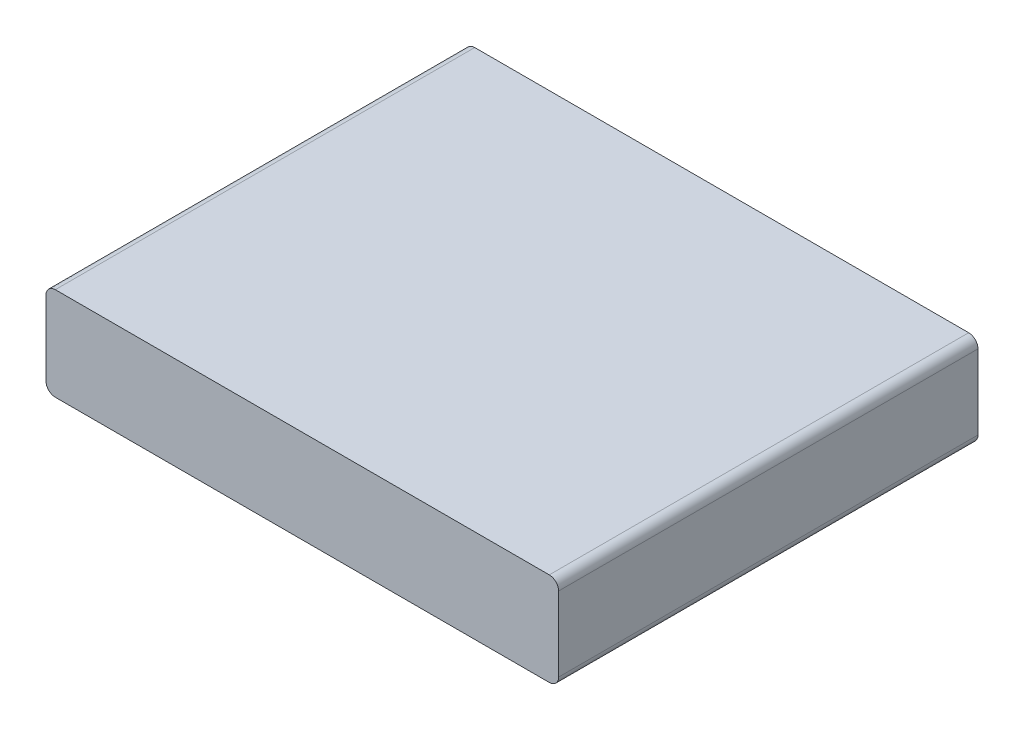
ISO-10303-21;
HEADER;
FILE_DESCRIPTION(('STEP AP214'),'2;1');
FILE_NAME('part.step','',(''),(''),'','','');
FILE_SCHEMA(('AUTOMOTIVE_DESIGN { 1 0 10303 214 1 1 1 1 }'));
ENDSEC;
DATA;
#1=APPLICATION_CONTEXT('core data for automotive mechanical design processes');
#2=APPLICATION_PROTOCOL_DEFINITION('international standard','automotive_design',2000,#1);
#3=PRODUCT_CONTEXT('',#1,'mechanical');
#4=PRODUCT('Part','Part','',(#3));
#5=PRODUCT_RELATED_PRODUCT_CATEGORY('part','',(#4));
#6=PRODUCT_DEFINITION_FORMATION('','',#4);
#7=PRODUCT_DEFINITION_CONTEXT('part definition',#1,'design');
#8=PRODUCT_DEFINITION('design','',#6,#7);
#9=PRODUCT_DEFINITION_SHAPE('','',#8);
#10=(LENGTH_UNIT() NAMED_UNIT(*) SI_UNIT(.MILLI.,.METRE.));
#11=(NAMED_UNIT(*) PLANE_ANGLE_UNIT() SI_UNIT($,.RADIAN.));
#12=(NAMED_UNIT(*) SI_UNIT($,.STERADIAN.) SOLID_ANGLE_UNIT());
#13=UNCERTAINTY_MEASURE_WITH_UNIT(LENGTH_MEASURE(1.E-05),#10,'distance_accuracy_value','');
#14=(GEOMETRIC_REPRESENTATION_CONTEXT(3) GLOBAL_UNCERTAINTY_ASSIGNED_CONTEXT((#13)) GLOBAL_UNIT_ASSIGNED_CONTEXT((#10,
#11,#12)) REPRESENTATION_CONTEXT('',''));
#15=CARTESIAN_POINT('',(0.,0.,0.));
#16=DIRECTION('',(0.,0.,1.));
#17=DIRECTION('',(1.,0.,0.));
#18=AXIS2_PLACEMENT_3D('',#15,#16,#17);
#19=CARTESIAN_POINT('',(-163.912429378531,100.,-242.973163841808));
#20=DIRECTION('',(1.,0.,0.));
#21=DIRECTION('',(0.,0.,-1.));
#22=AXIS2_PLACEMENT_3D('',#19,#20,#21);
#23=PLANE('',#22);
#24=DIRECTION('',(0.,-1.,0.));
#25=VECTOR('',#24,1.);
#26=CARTESIAN_POINT('',(-163.912429378531,100.,-242.973163841808));
#27=LINE('',#26,#25);
#28=CARTESIAN_POINT('',(-163.912429378531,90.,-242.973163841808));
#29=VERTEX_POINT('',#28);
#30=CARTESIAN_POINT('',(-163.912429378531,9.99999999999999,-242.973163841808));
#31=VERTEX_POINT('',#30);
#32=EDGE_CURVE('E121',#29,#31,#27,.T.);
#33=ORIENTED_EDGE('',*,*,#32,.T.);
#34=DIRECTION('',(0.,0.,1.));
#35=VECTOR('',#34,1.);
#36=CARTESIAN_POINT('',(-163.912429378531,9.99999999999999,-242.973163841808));
#37=LINE('',#36,#35);
#38=CARTESIAN_POINT('',(-163.912429378531,9.99999999999999,207.026836158192));
#39=VERTEX_POINT('',#38);
#40=EDGE_CURVE('E11',#31,#39,#37,.T.);
#41=ORIENTED_EDGE('',*,*,#40,.T.);
#42=DIRECTION('',(0.,-1.,0.));
#43=VECTOR('',#42,1.);
#44=CARTESIAN_POINT('',(-163.912429378531,100.,207.026836158192));
#45=LINE('',#44,#43);
#46=CARTESIAN_POINT('',(-163.912429378531,90.,207.026836158192));
#47=VERTEX_POINT('',#46);
#48=EDGE_CURVE('E126',#47,#39,#45,.T.);
#49=ORIENTED_EDGE('',*,*,#48,.F.);
#50=DIRECTION('',(0.,0.,1.));
#51=VECTOR('',#50,1.);
#52=CARTESIAN_POINT('',(-163.912429378531,90.,-242.973163841808));
#53=LINE('',#52,#51);
#54=EDGE_CURVE('E41',#47,#29,#53,.F.);
#55=ORIENTED_EDGE('',*,*,#54,.T.);
#56=EDGE_LOOP('',(#33,#41,#49,#55));
#57=FACE_BOUND('',#56,.T.);
#58=ADVANCED_FACE('F33',(#57),#23,.F.);
#59=CARTESIAN_POINT('',(-163.912429378531,100.,207.026836158192));
#60=DIRECTION('',(0.,0.,-1.));
#61=DIRECTION('',(-1.,0.,0.));
#62=AXIS2_PLACEMENT_3D('',#59,#60,#61);
#63=PLANE('',#62);
#64=DIRECTION('',(1.,0.,0.));
#65=VECTOR('',#64,1.);
#66=CARTESIAN_POINT('',(-163.912429378531,0.,207.026836158192));
#67=LINE('',#66,#65);
#68=CARTESIAN_POINT('',(-153.912429378531,0.,207.026836158192));
#69=VERTEX_POINT('',#68);
#70=CARTESIAN_POINT('',(376.087570621469,0.,207.026836158192));
#71=VERTEX_POINT('',#70);
#72=EDGE_CURVE('E168',#69,#71,#67,.T.);
#73=ORIENTED_EDGE('',*,*,#72,.T.);
#74=CARTESIAN_POINT('',(376.087570621469,9.99999999999999,207.026836158192));
#75=DIRECTION('',(0.,0.,-1.));
#76=DIRECTION('',(-1.,0.,0.));
#77=AXIS2_PLACEMENT_3D('',#74,#75,#76);
#78=CIRCLE('',#77,10.);
#79=CARTESIAN_POINT('',(386.087570621469,9.99999999999999,207.026836158192));
#80=VERTEX_POINT('',#79);
#81=EDGE_CURVE('E143',#71,#80,#78,.F.);
#82=ORIENTED_EDGE('',*,*,#81,.T.);
#83=DIRECTION('',(0.,-1.,0.));
#84=VECTOR('',#83,1.);
#85=CARTESIAN_POINT('',(386.087570621469,100.,207.026836158192));
#86=LINE('',#85,#84);
#87=CARTESIAN_POINT('',(386.087570621469,90.,207.026836158192));
#88=VERTEX_POINT('',#87);
#89=EDGE_CURVE('E120',#88,#80,#86,.T.);
#90=ORIENTED_EDGE('',*,*,#89,.F.);
#91=CARTESIAN_POINT('',(376.087570621469,90.,207.026836158192));
#92=DIRECTION('',(0.,0.,-1.));
#93=DIRECTION('',(-1.,0.,0.));
#94=AXIS2_PLACEMENT_3D('',#91,#92,#93);
#95=CIRCLE('',#94,10.);
#96=CARTESIAN_POINT('',(376.087570621469,100.,207.026836158192));
#97=VERTEX_POINT('',#96);
#98=EDGE_CURVE('E125',#88,#97,#95,.F.);
#99=ORIENTED_EDGE('',*,*,#98,.T.);
#100=DIRECTION('',(1.,0.,0.));
#101=VECTOR('',#100,1.);
#102=CARTESIAN_POINT('',(-163.912429378531,100.,207.026836158192));
#103=LINE('',#102,#101);
#104=CARTESIAN_POINT('',(-153.912429378531,100.,207.026836158192));
#105=VERTEX_POINT('',#104);
#106=EDGE_CURVE('E162',#105,#97,#103,.T.);
#107=ORIENTED_EDGE('',*,*,#106,.F.);
#108=CARTESIAN_POINT('',(-153.912429378531,90.,207.026836158192));
#109=DIRECTION('',(0.,0.,-1.));
#110=DIRECTION('',(-1.,0.,0.));
#111=AXIS2_PLACEMENT_3D('',#108,#109,#110);
#112=CIRCLE('',#111,10.);
#113=EDGE_CURVE('E55',#105,#47,#112,.F.);
#114=ORIENTED_EDGE('',*,*,#113,.T.);
#115=ORIENTED_EDGE('',*,*,#48,.T.);
#116=CARTESIAN_POINT('',(-153.912429378531,9.99999999999999,207.026836158192));
#117=DIRECTION('',(0.,0.,-1.));
#118=DIRECTION('',(-1.,0.,0.));
#119=AXIS2_PLACEMENT_3D('',#116,#117,#118);
#120=CIRCLE('',#119,10.);
#121=EDGE_CURVE('E48',#39,#69,#120,.F.);
#122=ORIENTED_EDGE('',*,*,#121,.T.);
#123=EDGE_LOOP('',(#73,#82,#90,#99,#107,#114,#115,#122));
#124=FACE_BOUND('',#123,.T.);
#125=ADVANCED_FACE('F164',(#124),#63,.F.);
#126=CARTESIAN_POINT('',(386.087570621469,100.,-242.973163841808));
#127=DIRECTION('',(-1.,0.,0.));
#128=DIRECTION('',(0.,0.,1.));
#129=AXIS2_PLACEMENT_3D('',#126,#127,#128);
#130=PLANE('',#129);
#131=ORIENTED_EDGE('',*,*,#89,.T.);
#132=DIRECTION('',(0.,0.,-1.));
#133=VECTOR('',#132,1.);
#134=CARTESIAN_POINT('',(386.087570621469,9.99999999999999,-242.973163841808));
#135=LINE('',#134,#133);
#136=CARTESIAN_POINT('',(386.087570621469,9.99999999999999,-242.973163841808));
#137=VERTEX_POINT('',#136);
#138=EDGE_CURVE('E119',#80,#137,#135,.T.);
#139=ORIENTED_EDGE('',*,*,#138,.T.);
#140=DIRECTION('',(0.,-1.,0.));
#141=VECTOR('',#140,1.);
#142=CARTESIAN_POINT('',(386.087570621469,100.,-242.973163841808));
#143=LINE('',#142,#141);
#144=CARTESIAN_POINT('',(386.087570621469,90.,-242.973163841808));
#145=VERTEX_POINT('',#144);
#146=EDGE_CURVE('E102',#145,#137,#143,.T.);
#147=ORIENTED_EDGE('',*,*,#146,.F.);
#148=DIRECTION('',(0.,0.,-1.));
#149=VECTOR('',#148,1.);
#150=CARTESIAN_POINT('',(386.087570621469,90.,207.026836158192));
#151=LINE('',#150,#149);
#152=EDGE_CURVE('E116',#145,#88,#151,.F.);
#153=ORIENTED_EDGE('',*,*,#152,.T.);
#154=EDGE_LOOP('',(#131,#139,#147,#153));
#155=FACE_BOUND('',#154,.T.);
#156=ADVANCED_FACE('F115',(#155),#130,.F.);
#157=CARTESIAN_POINT('',(-163.912429378531,100.,-242.973163841808));
#158=DIRECTION('',(0.,0.,1.));
#159=DIRECTION('',(1.,0.,0.));
#160=AXIS2_PLACEMENT_3D('',#157,#158,#159);
#161=PLANE('',#160);
#162=ORIENTED_EDGE('',*,*,#146,.T.);
#163=CARTESIAN_POINT('',(376.087570621469,9.99999999999999,-242.973163841808));
#164=DIRECTION('',(0.,0.,1.));
#165=DIRECTION('',(1.,0.,0.));
#166=AXIS2_PLACEMENT_3D('',#163,#164,#165);
#167=CIRCLE('',#166,10.);
#168=CARTESIAN_POINT('',(376.087570621469,0.,-242.973163841808));
#169=VERTEX_POINT('',#168);
#170=EDGE_CURVE('E109',#137,#169,#167,.F.);
#171=ORIENTED_EDGE('',*,*,#170,.T.);
#172=DIRECTION('',(-1.,0.,0.));
#173=VECTOR('',#172,1.);
#174=CARTESIAN_POINT('',(-163.912429378531,0.,-242.973163841808));
#175=LINE('',#174,#173);
#176=CARTESIAN_POINT('',(-153.912429378531,0.,-242.973163841808));
#177=VERTEX_POINT('',#176);
#178=EDGE_CURVE('E165',#169,#177,#175,.T.);
#179=ORIENTED_EDGE('',*,*,#178,.T.);
#180=CARTESIAN_POINT('',(-153.912429378531,9.99999999999999,-242.973163841808));
#181=DIRECTION('',(0.,0.,1.));
#182=DIRECTION('',(1.,0.,0.));
#183=AXIS2_PLACEMENT_3D('',#180,#181,#182);
#184=CIRCLE('',#183,10.);
#185=EDGE_CURVE('E110',#177,#31,#184,.F.);
#186=ORIENTED_EDGE('',*,*,#185,.T.);
#187=ORIENTED_EDGE('',*,*,#32,.F.);
#188=CARTESIAN_POINT('',(-153.912429378531,90.,-242.973163841808));
#189=DIRECTION('',(0.,0.,1.));
#190=DIRECTION('',(1.,0.,0.));
#191=AXIS2_PLACEMENT_3D('',#188,#189,#190);
#192=CIRCLE('',#191,10.);
#193=CARTESIAN_POINT('',(-153.912429378531,100.,-242.973163841808));
#194=VERTEX_POINT('',#193);
#195=EDGE_CURVE('E128',#29,#194,#192,.F.);
#196=ORIENTED_EDGE('',*,*,#195,.T.);
#197=DIRECTION('',(-1.,0.,0.));
#198=VECTOR('',#197,1.);
#199=CARTESIAN_POINT('',(-163.912429378531,100.,-242.973163841808));
#200=LINE('',#199,#198);
#201=CARTESIAN_POINT('',(376.087570621469,100.,-242.973163841808));
#202=VERTEX_POINT('',#201);
#203=EDGE_CURVE('E104',#202,#194,#200,.T.);
#204=ORIENTED_EDGE('',*,*,#203,.F.);
#205=CARTESIAN_POINT('',(376.087570621469,90.,-242.973163841808));
#206=DIRECTION('',(0.,0.,1.));
#207=DIRECTION('',(1.,0.,0.));
#208=AXIS2_PLACEMENT_3D('',#205,#206,#207);
#209=CIRCLE('',#208,10.);
#210=EDGE_CURVE('E99',#202,#145,#209,.F.);
#211=ORIENTED_EDGE('',*,*,#210,.T.);
#212=EDGE_LOOP('',(#162,#171,#179,#186,#187,#196,#204,#211));
#213=FACE_BOUND('',#212,.T.);
#214=ADVANCED_FACE('F101',(#213),#161,.F.);
#215=CARTESIAN_POINT('',(0.,100.,0.));
#216=DIRECTION('',(0.,1.,0.));
#217=DIRECTION('',(0.,0.,1.));
#218=AXIS2_PLACEMENT_3D('',#215,#216,#217);
#219=PLANE('',#218);
#220=ORIENTED_EDGE('',*,*,#106,.T.);
#221=DIRECTION('',(0.,0.,-1.));
#222=VECTOR('',#221,1.);
#223=CARTESIAN_POINT('',(376.087570621469,100.,-242.973163841808));
#224=LINE('',#223,#222);
#225=EDGE_CURVE('E148',#97,#202,#224,.T.);
#226=ORIENTED_EDGE('',*,*,#225,.T.);
#227=ORIENTED_EDGE('',*,*,#203,.T.);
#228=DIRECTION('',(0.,0.,1.));
#229=VECTOR('',#228,1.);
#230=CARTESIAN_POINT('',(-153.912429378531,100.,207.026836158192));
#231=LINE('',#230,#229);
#232=EDGE_CURVE('E145',#194,#105,#231,.T.);
#233=ORIENTED_EDGE('',*,*,#232,.T.);
#234=EDGE_LOOP('',(#220,#226,#227,#233));
#235=FACE_BOUND('',#234,.T.);
#236=ADVANCED_FACE('F161',(#235),#219,.T.);
#237=CARTESIAN_POINT('',(0.,0.,0.));
#238=DIRECTION('',(0.,1.,0.));
#239=DIRECTION('',(0.,0.,1.));
#240=AXIS2_PLACEMENT_3D('',#237,#238,#239);
#241=PLANE('',#240);
#242=ORIENTED_EDGE('',*,*,#178,.F.);
#243=DIRECTION('',(0.,0.,-1.));
#244=VECTOR('',#243,1.);
#245=CARTESIAN_POINT('',(376.087570621469,0.,0.));
#246=LINE('',#245,#244);
#247=EDGE_CURVE('E138',#169,#71,#246,.F.);
#248=ORIENTED_EDGE('',*,*,#247,.T.);
#249=ORIENTED_EDGE('',*,*,#72,.F.);
#250=DIRECTION('',(0.,0.,1.));
#251=VECTOR('',#250,1.);
#252=CARTESIAN_POINT('',(-153.912429378531,0.,0.));
#253=LINE('',#252,#251);
#254=EDGE_CURVE('E136',#69,#177,#253,.F.);
#255=ORIENTED_EDGE('',*,*,#254,.T.);
#256=EDGE_LOOP('',(#242,#248,#249,#255));
#257=FACE_BOUND('',#256,.T.);
#258=ADVANCED_FACE('F177',(#257),#241,.F.);
#259=CARTESIAN_POINT('',(376.087570621469,9.99999999999999,-242.973163841808));
#260=DIRECTION('',(0.,0.,-1.));
#261=DIRECTION('',(-1.,0.,0.));
#262=AXIS2_PLACEMENT_3D('',#259,#260,#261);
#263=CYLINDRICAL_SURFACE('',#262,10.);
#264=ORIENTED_EDGE('',*,*,#81,.F.);
#265=ORIENTED_EDGE('',*,*,#247,.F.);
#266=ORIENTED_EDGE('',*,*,#170,.F.);
#267=ORIENTED_EDGE('',*,*,#138,.F.);
#268=EDGE_LOOP('',(#264,#265,#266,#267));
#269=FACE_BOUND('',#268,.T.);
#270=ADVANCED_FACE('F173',(#269),#263,.T.);
#271=CARTESIAN_POINT('',(376.087570621469,90.,0.));
#272=DIRECTION('',(0.,0.,1.));
#273=DIRECTION('',(1.,0.,0.));
#274=AXIS2_PLACEMENT_3D('',#271,#272,#273);
#275=CYLINDRICAL_SURFACE('',#274,10.);
#276=ORIENTED_EDGE('',*,*,#98,.F.);
#277=ORIENTED_EDGE('',*,*,#152,.F.);
#278=ORIENTED_EDGE('',*,*,#210,.F.);
#279=ORIENTED_EDGE('',*,*,#225,.F.);
#280=EDGE_LOOP('',(#276,#277,#278,#279));
#281=FACE_BOUND('',#280,.T.);
#282=ADVANCED_FACE('F124',(#281),#275,.T.);
#283=CARTESIAN_POINT('',(-153.912429378531,9.99999999999999,-242.973163841808));
#284=DIRECTION('',(0.,0.,1.));
#285=DIRECTION('',(1.,0.,0.));
#286=AXIS2_PLACEMENT_3D('',#283,#284,#285);
#287=CYLINDRICAL_SURFACE('',#286,10.);
#288=ORIENTED_EDGE('',*,*,#185,.F.);
#289=ORIENTED_EDGE('',*,*,#254,.F.);
#290=ORIENTED_EDGE('',*,*,#121,.F.);
#291=ORIENTED_EDGE('',*,*,#40,.F.);
#292=EDGE_LOOP('',(#288,#289,#290,#291));
#293=FACE_BOUND('',#292,.T.);
#294=ADVANCED_FACE('F179',(#293),#287,.T.);
#295=CARTESIAN_POINT('',(-153.912429378531,90.,0.));
#296=DIRECTION('',(0.,0.,-1.));
#297=DIRECTION('',(-1.,0.,0.));
#298=AXIS2_PLACEMENT_3D('',#295,#296,#297);
#299=CYLINDRICAL_SURFACE('',#298,10.);
#300=ORIENTED_EDGE('',*,*,#195,.F.);
#301=ORIENTED_EDGE('',*,*,#54,.F.);
#302=ORIENTED_EDGE('',*,*,#113,.F.);
#303=ORIENTED_EDGE('',*,*,#232,.F.);
#304=EDGE_LOOP('',(#300,#301,#302,#303));
#305=FACE_BOUND('',#304,.T.);
#306=ADVANCED_FACE('F35',(#305),#299,.T.);
#307=CLOSED_SHELL('',(#58,#125,#156,#214,#236,#258,#270,#282,#294,#306));
#308=MANIFOLD_SOLID_BREP('B2',#307);
#309=ADVANCED_BREP_SHAPE_REPRESENTATION('',(#18,#308),#14);
#310=SHAPE_DEFINITION_REPRESENTATION(#9,#309);
ENDSEC;
END-ISO-10303-21;
